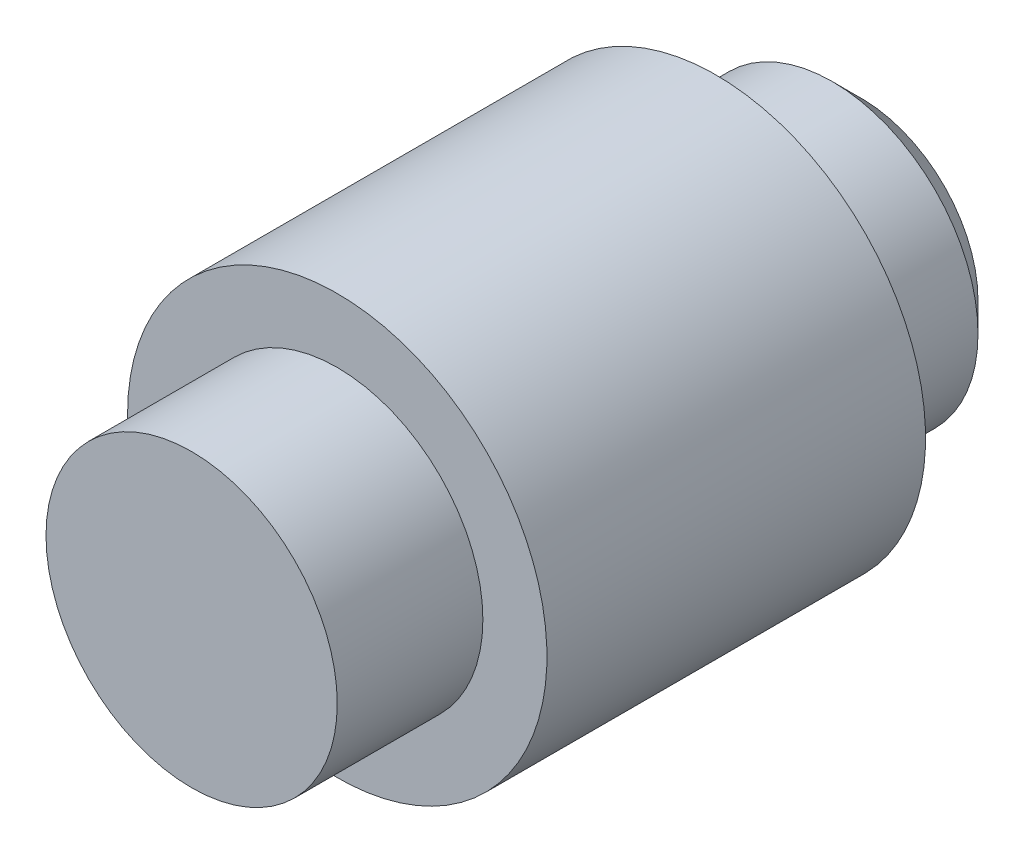
ISO-10303-21;
HEADER;
FILE_DESCRIPTION(('STEP AP214'),'2;1');
FILE_NAME('part.step','',(''),(''),'','','');
FILE_SCHEMA(('AUTOMOTIVE_DESIGN { 1 0 10303 214 1 1 1 1 }'));
ENDSEC;
DATA;
#1=APPLICATION_CONTEXT('core data for automotive mechanical design processes');
#2=APPLICATION_PROTOCOL_DEFINITION('international standard','automotive_design',2000,#1);
#3=PRODUCT_CONTEXT('',#1,'mechanical');
#4=PRODUCT('Part','Part','',(#3));
#5=PRODUCT_RELATED_PRODUCT_CATEGORY('part','',(#4));
#6=PRODUCT_DEFINITION_FORMATION('','',#4);
#7=PRODUCT_DEFINITION_CONTEXT('part definition',#1,'design');
#8=PRODUCT_DEFINITION('design','',#6,#7);
#9=PRODUCT_DEFINITION_SHAPE('','',#8);
#10=(LENGTH_UNIT() NAMED_UNIT(*) SI_UNIT(.MILLI.,.METRE.));
#11=(NAMED_UNIT(*) PLANE_ANGLE_UNIT() SI_UNIT($,.RADIAN.));
#12=(NAMED_UNIT(*) SI_UNIT($,.STERADIAN.) SOLID_ANGLE_UNIT());
#13=UNCERTAINTY_MEASURE_WITH_UNIT(LENGTH_MEASURE(1.E-05),#10,'distance_accuracy_value','');
#14=(GEOMETRIC_REPRESENTATION_CONTEXT(3) GLOBAL_UNCERTAINTY_ASSIGNED_CONTEXT((#13)) GLOBAL_UNIT_ASSIGNED_CONTEXT((#10,
#11,#12)) REPRESENTATION_CONTEXT('',''));
#15=CARTESIAN_POINT('',(0.,0.,0.));
#16=DIRECTION('',(0.,0.,1.));
#17=DIRECTION('',(1.,0.,0.));
#18=AXIS2_PLACEMENT_3D('',#15,#16,#17);
#19=CARTESIAN_POINT('',(0.,0.,6.5));
#20=DIRECTION('',(0.,0.,-1.));
#21=DIRECTION('',(-1.,0.,0.));
#22=AXIS2_PLACEMENT_3D('',#19,#20,#21);
#23=CYLINDRICAL_SURFACE('',#22,3.6);
#24=CARTESIAN_POINT('',(0.,0.,6.5));
#25=DIRECTION('',(0.,0.,1.));
#26=DIRECTION('',(1.,0.,0.));
#27=AXIS2_PLACEMENT_3D('',#24,#25,#26);
#28=CIRCLE('',#27,3.6);
#29=CARTESIAN_POINT('',(-3.6,0.,6.5));
#30=VERTEX_POINT('',#29);
#31=EDGE_CURVE('E49',#30,#30,#28,.T.);
#32=CARTESIAN_POINT('',(0.,0.,0.));
#33=DIRECTION('',(0.,0.,1.));
#34=DIRECTION('',(1.,0.,0.));
#35=AXIS2_PLACEMENT_3D('',#32,#33,#34);
#36=CIRCLE('',#35,3.6);
#37=CARTESIAN_POINT('',(-3.6,0.,0.));
#38=VERTEX_POINT('',#37);
#39=EDGE_CURVE('E52',#38,#38,#36,.T.);
#40=CARTESIAN_POINT('',(-3.6,0.,6.5));
#41=CARTESIAN_POINT('',(-3.6,0.,6.43229166666667));
#42=CARTESIAN_POINT('',(-3.6,0.,6.36458333333333));
#43=CARTESIAN_POINT('',(-3.6,0.,6.22916666666667));
#44=CARTESIAN_POINT('',(-3.6,0.,6.16145833333333));
#45=CARTESIAN_POINT('',(-3.6,0.,6.02604166666667));
#46=CARTESIAN_POINT('',(-3.6,0.,5.95833333333333));
#47=CARTESIAN_POINT('',(-3.6,0.,5.82291666666667));
#48=CARTESIAN_POINT('',(-3.6,0.,5.75520833333333));
#49=CARTESIAN_POINT('',(-3.6,0.,5.61979166666667));
#50=CARTESIAN_POINT('',(-3.6,0.,5.55208333333333));
#51=CARTESIAN_POINT('',(-3.6,0.,5.41666666666667));
#52=CARTESIAN_POINT('',(-3.6,0.,5.34895833333333));
#53=CARTESIAN_POINT('',(-3.6,0.,5.21354166666667));
#54=CARTESIAN_POINT('',(-3.6,0.,5.14583333333333));
#55=CARTESIAN_POINT('',(-3.6,0.,5.01041666666667));
#56=CARTESIAN_POINT('',(-3.6,0.,4.94270833333333));
#57=CARTESIAN_POINT('',(-3.6,0.,4.80729166666667));
#58=CARTESIAN_POINT('',(-3.6,0.,4.73958333333333));
#59=CARTESIAN_POINT('',(-3.6,0.,4.60416666666667));
#60=CARTESIAN_POINT('',(-3.6,0.,4.53645833333333));
#61=CARTESIAN_POINT('',(-3.6,0.,4.40104166666667));
#62=CARTESIAN_POINT('',(-3.6,0.,4.33333333333333));
#63=CARTESIAN_POINT('',(-3.6,0.,4.19791666666667));
#64=CARTESIAN_POINT('',(-3.6,0.,4.13020833333333));
#65=CARTESIAN_POINT('',(-3.6,0.,3.99479166666667));
#66=CARTESIAN_POINT('',(-3.6,0.,3.92708333333333));
#67=CARTESIAN_POINT('',(-3.6,0.,3.79166666666667));
#68=CARTESIAN_POINT('',(-3.6,0.,3.72395833333333));
#69=CARTESIAN_POINT('',(-3.6,0.,3.58854166666667));
#70=CARTESIAN_POINT('',(-3.6,0.,3.52083333333333));
#71=CARTESIAN_POINT('',(-3.6,0.,3.38541666666667));
#72=CARTESIAN_POINT('',(-3.6,0.,3.31770833333333));
#73=CARTESIAN_POINT('',(-3.6,0.,3.18229166666667));
#74=CARTESIAN_POINT('',(-3.6,0.,3.11458333333333));
#75=CARTESIAN_POINT('',(-3.6,0.,2.97916666666667));
#76=CARTESIAN_POINT('',(-3.6,0.,2.91145833333333));
#77=CARTESIAN_POINT('',(-3.6,0.,2.77604166666667));
#78=CARTESIAN_POINT('',(-3.6,0.,2.70833333333333));
#79=CARTESIAN_POINT('',(-3.6,0.,2.57291666666667));
#80=CARTESIAN_POINT('',(-3.6,0.,2.50520833333333));
#81=CARTESIAN_POINT('',(-3.6,0.,2.36979166666667));
#82=CARTESIAN_POINT('',(-3.6,0.,2.30208333333333));
#83=CARTESIAN_POINT('',(-3.6,0.,2.16666666666667));
#84=CARTESIAN_POINT('',(-3.6,0.,2.09895833333333));
#85=CARTESIAN_POINT('',(-3.6,0.,1.96354166666667));
#86=CARTESIAN_POINT('',(-3.6,0.,1.89583333333333));
#87=CARTESIAN_POINT('',(-3.6,0.,1.76041666666667));
#88=CARTESIAN_POINT('',(-3.6,0.,1.69270833333333));
#89=CARTESIAN_POINT('',(-3.6,0.,1.55729166666667));
#90=CARTESIAN_POINT('',(-3.6,0.,1.48958333333333));
#91=CARTESIAN_POINT('',(-3.6,0.,1.35416666666667));
#92=CARTESIAN_POINT('',(-3.6,0.,1.28645833333333));
#93=CARTESIAN_POINT('',(-3.6,0.,1.15104166666667));
#94=CARTESIAN_POINT('',(-3.6,0.,1.08333333333333));
#95=CARTESIAN_POINT('',(-3.6,0.,0.947916666666667));
#96=CARTESIAN_POINT('',(-3.6,0.,0.880208333333333));
#97=CARTESIAN_POINT('',(-3.6,0.,0.744791666666667));
#98=CARTESIAN_POINT('',(-3.6,0.,0.677083333333333));
#99=CARTESIAN_POINT('',(-3.6,0.,0.541666666666667));
#100=CARTESIAN_POINT('',(-3.6,0.,0.473958333333333));
#101=CARTESIAN_POINT('',(-3.6,0.,0.338541666666667));
#102=CARTESIAN_POINT('',(-3.6,0.,0.270833333333334));
#103=CARTESIAN_POINT('',(-3.6,0.,0.135416666666667));
#104=CARTESIAN_POINT('',(-3.6,0.,0.0677083333333334));
#105=CARTESIAN_POINT('',(-3.6,0.,0.));
#106=B_SPLINE_CURVE_WITH_KNOTS('',3,(#40,#41,#42,#43,#44,#45,#46,#47,#48,#49,#50,#51,#52,#53,
#54,#55,#56,#57,#58,#59,#60,#61,#62,#63,#64,#65,#66,#67,#68,#69,#70,#71,#72,#73,#74,#75,#76,#77,
#78,#79,#80,#81,#82,#83,#84,#85,#86,#87,#88,#89,#90,#91,#92,#93,#94,#95,#96,#97,#98,#99,#100,
#101,#102,#103,#104,#105),.UNSPECIFIED.,.F.,.F.,(4,2,2,2,2,2,2,2,2,2,2,2,2,2,2,2,2,2,2,2,2,2,2,
2,2,2,2,2,2,2,2,2,4),(0.,0.203125,0.40625,0.609375000000001,0.812500000000001,1.015625,1.21875,
1.421875,1.625,1.828125,2.03125,2.234375,2.4375,2.640625,2.84375,3.046875,3.25,3.453125,3.65625,
3.859375,4.0625,4.265625,4.46875,4.671875,4.875,5.078125,5.28125,5.484375,5.6875,5.890625,
6.09375,6.296875,6.5),.UNSPECIFIED.);
#107=EDGE_CURVE('BSEAM33',#30,#38,#106,.T.);
#108=ORIENTED_EDGE('',*,*,#31,.F.);
#109=ORIENTED_EDGE('',*,*,#39,.T.);
#110=ORIENTED_EDGE('',*,*,#107,.T.);
#111=ORIENTED_EDGE('',*,*,#107,.F.);
#112=EDGE_LOOP('',(#108,#110,#109,#111));
#113=FACE_BOUND('',#112,.T.);
#114=ADVANCED_FACE('F33',(#113),#23,.T.);
#115=CARTESIAN_POINT('',(0.,0.,6.5));
#116=DIRECTION('',(0.,0.,1.));
#117=DIRECTION('',(1.,0.,0.));
#118=AXIS2_PLACEMENT_3D('',#115,#116,#117);
#119=PLANE('',#118);
#120=CARTESIAN_POINT('',(0.,0.,6.5));
#121=DIRECTION('',(0.,0.,1.));
#122=DIRECTION('',(1.,0.,0.));
#123=AXIS2_PLACEMENT_3D('',#120,#121,#122);
#124=CIRCLE('',#123,2.5);
#125=CARTESIAN_POINT('',(2.5,0.,6.5));
#126=VERTEX_POINT('',#125);
#127=EDGE_CURVE('E45',#126,#126,#124,.T.);
#128=ORIENTED_EDGE('',*,*,#127,.F.);
#129=EDGE_LOOP('',(#128));
#130=FACE_BOUND('',#129,.T.);
#131=ORIENTED_EDGE('',*,*,#31,.T.);
#132=EDGE_LOOP('',(#131));
#133=FACE_BOUND('',#132,.T.);
#134=ADVANCED_FACE('F73',(#130,#133),#119,.T.);
#135=CARTESIAN_POINT('',(0.,0.,0.));
#136=DIRECTION('',(0.,0.,1.));
#137=DIRECTION('',(1.,0.,0.));
#138=AXIS2_PLACEMENT_3D('',#135,#136,#137);
#139=PLANE('',#138);
#140=CARTESIAN_POINT('',(0.,0.,0.));
#141=DIRECTION('',(0.,0.,1.));
#142=DIRECTION('',(1.,0.,0.));
#143=AXIS2_PLACEMENT_3D('',#140,#141,#142);
#144=CIRCLE('',#143,2.5);
#145=CARTESIAN_POINT('',(2.5,0.,0.));
#146=VERTEX_POINT('',#145);
#147=EDGE_CURVE('E55',#146,#146,#144,.T.);
#148=ORIENTED_EDGE('',*,*,#147,.T.);
#149=EDGE_LOOP('',(#148));
#150=FACE_BOUND('',#149,.T.);
#151=ORIENTED_EDGE('',*,*,#39,.F.);
#152=EDGE_LOOP('',(#151));
#153=FACE_BOUND('',#152,.T.);
#154=ADVANCED_FACE('F76',(#150,#153),#139,.F.);
#155=CARTESIAN_POINT('',(0.,0.,-2.5));
#156=DIRECTION('',(0.,0.,1.));
#157=DIRECTION('',(1.,0.,0.));
#158=AXIS2_PLACEMENT_3D('',#155,#156,#157);
#159=CYLINDRICAL_SURFACE('',#158,2.5);
#160=CARTESIAN_POINT('',(0.,0.,-2.));
#161=DIRECTION('',(0.,0.,1.));
#162=DIRECTION('',(1.,0.,0.));
#163=AXIS2_PLACEMENT_3D('',#160,#161,#162);
#164=CIRCLE('',#163,2.5);
#165=CARTESIAN_POINT('',(2.5,0.,-2.));
#166=VERTEX_POINT('',#165);
#167=EDGE_CURVE('E41',#166,#166,#164,.T.);
#168=ORIENTED_EDGE('',*,*,#167,.T.);
#169=EDGE_LOOP('',(#168));
#170=FACE_BOUND('',#169,.T.);
#171=ORIENTED_EDGE('',*,*,#147,.F.);
#172=EDGE_LOOP('',(#171));
#173=FACE_BOUND('',#172,.T.);
#174=ADVANCED_FACE('F85',(#170,#173),#159,.T.);
#175=CARTESIAN_POINT('',(0.,0.,-2.5));
#176=DIRECTION('',(0.,0.,1.));
#177=DIRECTION('',(1.,0.,0.));
#178=AXIS2_PLACEMENT_3D('',#175,#176,#177);
#179=PLANE('',#178);
#180=CARTESIAN_POINT('',(0.,0.,-2.5));
#181=DIRECTION('',(0.,0.,1.));
#182=DIRECTION('',(1.,0.,0.));
#183=AXIS2_PLACEMENT_3D('',#180,#181,#182);
#184=CIRCLE('',#183,2.);
#185=CARTESIAN_POINT('',(2.,0.,-2.5));
#186=VERTEX_POINT('',#185);
#187=EDGE_CURVE('E10',#186,#186,#184,.F.);
#188=ORIENTED_EDGE('',*,*,#187,.T.);
#189=EDGE_LOOP('',(#188));
#190=FACE_BOUND('',#189,.T.);
#191=ADVANCED_FACE('F69',(#190),#179,.F.);
#192=CARTESIAN_POINT('',(0.,0.,9.));
#193=DIRECTION('',(0.,0.,-1.));
#194=DIRECTION('',(-1.,0.,0.));
#195=AXIS2_PLACEMENT_3D('',#192,#193,#194);
#196=CYLINDRICAL_SURFACE('',#195,2.5);
#197=CARTESIAN_POINT('',(0.,0.,9.));
#198=DIRECTION('',(0.,0.,1.));
#199=DIRECTION('',(1.,0.,0.));
#200=AXIS2_PLACEMENT_3D('',#197,#198,#199);
#201=CIRCLE('',#200,2.5);
#202=CARTESIAN_POINT('',(2.5,0.,9.));
#203=VERTEX_POINT('',#202);
#204=EDGE_CURVE('E59',#203,#203,#201,.T.);
#205=ORIENTED_EDGE('',*,*,#204,.F.);
#206=EDGE_LOOP('',(#205));
#207=FACE_BOUND('',#206,.T.);
#208=ORIENTED_EDGE('',*,*,#127,.T.);
#209=EDGE_LOOP('',(#208));
#210=FACE_BOUND('',#209,.T.);
#211=ADVANCED_FACE('F66',(#207,#210),#196,.T.);
#212=CARTESIAN_POINT('',(0.,0.,9.));
#213=DIRECTION('',(0.,0.,1.));
#214=DIRECTION('',(1.,0.,0.));
#215=AXIS2_PLACEMENT_3D('',#212,#213,#214);
#216=PLANE('',#215);
#217=ORIENTED_EDGE('',*,*,#204,.T.);
#218=EDGE_LOOP('',(#217));
#219=FACE_BOUND('',#218,.T.);
#220=ADVANCED_FACE('F64',(#219),#216,.T.);
#221=CARTESIAN_POINT('',(0.,0.,-2.));
#222=DIRECTION('',(0.,0.,1.));
#223=DIRECTION('',(1.,0.,0.));
#224=AXIS2_PLACEMENT_3D('',#221,#222,#223);
#225=CONICAL_SURFACE('',#224,2.5,0.78539816339745);
#226=ORIENTED_EDGE('',*,*,#187,.F.);
#227=EDGE_LOOP('',(#226));
#228=FACE_BOUND('',#227,.T.);
#229=ORIENTED_EDGE('',*,*,#167,.F.);
#230=EDGE_LOOP('',(#229));
#231=FACE_BOUND('',#230,.T.);
#232=ADVANCED_FACE('F36',(#228,#231),#225,.T.);
#233=CLOSED_SHELL('',(#114,#134,#154,#174,#191,#211,#220,#232));
#234=MANIFOLD_SOLID_BREP('B2',#233);
#235=ADVANCED_BREP_SHAPE_REPRESENTATION('',(#18,#234),#14);
#236=SHAPE_DEFINITION_REPRESENTATION(#9,#235);
ENDSEC;
END-ISO-10303-21;
